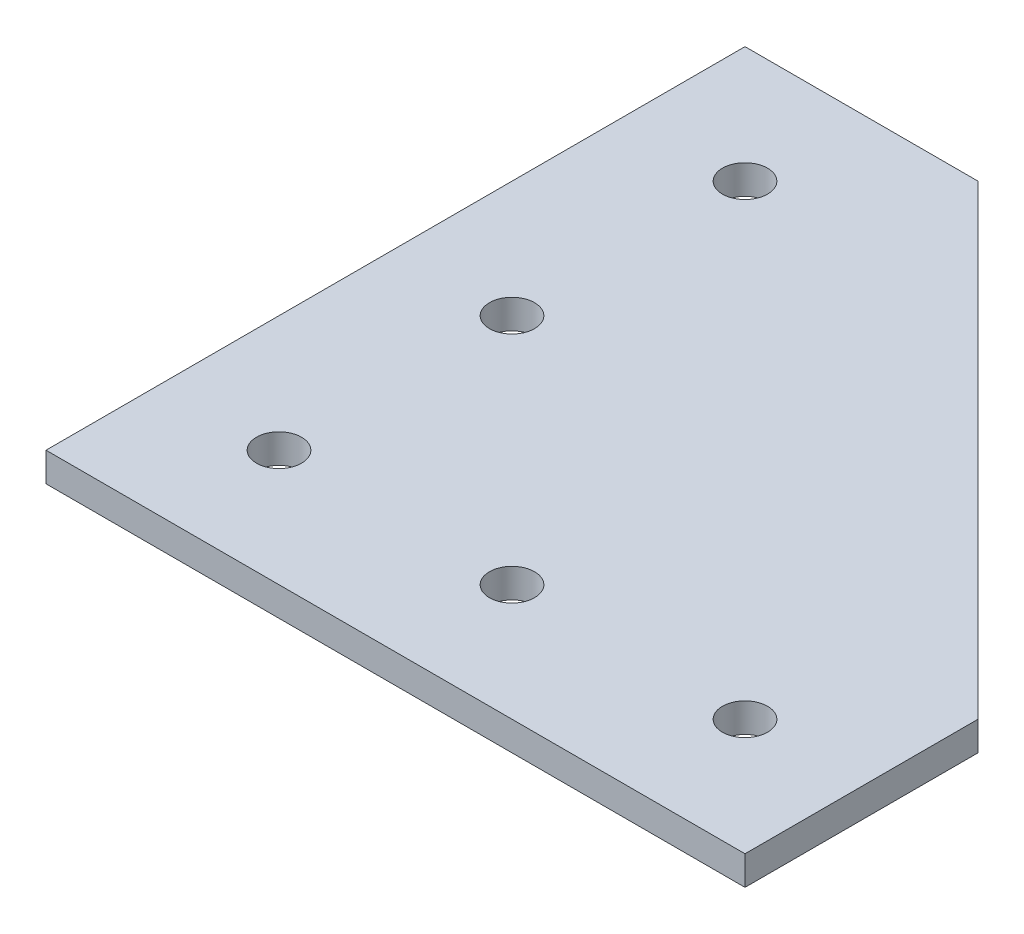
ISO-10303-21;
HEADER;
FILE_DESCRIPTION(('STEP AP214'),'2;1');
FILE_NAME('part.step','',(''),(''),'','','');
FILE_SCHEMA(('AUTOMOTIVE_DESIGN { 1 0 10303 214 1 1 1 1 }'));
ENDSEC;
DATA;
#1=APPLICATION_CONTEXT('core data for automotive mechanical design processes');
#2=APPLICATION_PROTOCOL_DEFINITION('international standard','automotive_design',2000,#1);
#3=PRODUCT_CONTEXT('',#1,'mechanical');
#4=PRODUCT('Part','Part','',(#3));
#5=PRODUCT_RELATED_PRODUCT_CATEGORY('part','',(#4));
#6=PRODUCT_DEFINITION_FORMATION('','',#4);
#7=PRODUCT_DEFINITION_CONTEXT('part definition',#1,'design');
#8=PRODUCT_DEFINITION('design','',#6,#7);
#9=PRODUCT_DEFINITION_SHAPE('','',#8);
#10=(LENGTH_UNIT() NAMED_UNIT(*) SI_UNIT(.MILLI.,.METRE.));
#11=(NAMED_UNIT(*) PLANE_ANGLE_UNIT() SI_UNIT($,.RADIAN.));
#12=(NAMED_UNIT(*) SI_UNIT($,.STERADIAN.) SOLID_ANGLE_UNIT());
#13=UNCERTAINTY_MEASURE_WITH_UNIT(LENGTH_MEASURE(1.E-05),#10,'distance_accuracy_value','');
#14=(GEOMETRIC_REPRESENTATION_CONTEXT(3) GLOBAL_UNCERTAINTY_ASSIGNED_CONTEXT((#13)) GLOBAL_UNIT_ASSIGNED_CONTEXT((#10,
#11,#12)) REPRESENTATION_CONTEXT('',''));
#15=CARTESIAN_POINT('',(0.,0.,0.));
#16=DIRECTION('',(0.,0.,1.));
#17=DIRECTION('',(1.,0.,0.));
#18=AXIS2_PLACEMENT_3D('',#15,#16,#17);
#19=CARTESIAN_POINT('',(76.2,3.175,0.));
#20=DIRECTION('',(0.,0.,-1.));
#21=DIRECTION('',(-1.,0.,0.));
#22=AXIS2_PLACEMENT_3D('',#19,#20,#21);
#23=PLANE('',#22);
#24=DIRECTION('',(1.,0.,0.));
#25=VECTOR('',#24,1.);
#26=CARTESIAN_POINT('',(76.2,0.,0.));
#27=LINE('',#26,#25);
#28=CARTESIAN_POINT('',(0.,0.,0.));
#29=VERTEX_POINT('',#28);
#30=CARTESIAN_POINT('',(76.2,0.,0.));
#31=VERTEX_POINT('',#30);
#32=EDGE_CURVE('E106',#29,#31,#27,.T.);
#33=ORIENTED_EDGE('',*,*,#32,.T.);
#34=DIRECTION('',(0.,-1.,0.));
#35=VECTOR('',#34,1.);
#36=CARTESIAN_POINT('',(76.2,3.175,0.));
#37=LINE('',#36,#35);
#38=CARTESIAN_POINT('',(76.2,3.175,0.));
#39=VERTEX_POINT('',#38);
#40=EDGE_CURVE('E11',#39,#31,#37,.T.);
#41=ORIENTED_EDGE('',*,*,#40,.F.);
#42=DIRECTION('',(1.,0.,0.));
#43=VECTOR('',#42,1.);
#44=CARTESIAN_POINT('',(76.2,3.175,0.));
#45=LINE('',#44,#43);
#46=CARTESIAN_POINT('',(0.,3.175,0.));
#47=VERTEX_POINT('',#46);
#48=EDGE_CURVE('E115',#47,#39,#45,.T.);
#49=ORIENTED_EDGE('',*,*,#48,.F.);
#50=DIRECTION('',(0.,-1.,0.));
#51=VECTOR('',#50,1.);
#52=CARTESIAN_POINT('',(0.,3.175,0.));
#53=LINE('',#52,#51);
#54=EDGE_CURVE('E102',#47,#29,#53,.T.);
#55=ORIENTED_EDGE('',*,*,#54,.T.);
#56=EDGE_LOOP('',(#33,#41,#49,#55));
#57=FACE_BOUND('',#56,.T.);
#58=ADVANCED_FACE('F32',(#57),#23,.F.);
#59=CARTESIAN_POINT('',(76.2,3.175,0.));
#60=DIRECTION('',(-1.,0.,0.));
#61=DIRECTION('',(0.,0.,1.));
#62=AXIS2_PLACEMENT_3D('',#59,#60,#61);
#63=PLANE('',#62);
#64=DIRECTION('',(0.,0.,-1.));
#65=VECTOR('',#64,1.);
#66=CARTESIAN_POINT('',(76.2,0.,0.));
#67=LINE('',#66,#65);
#68=CARTESIAN_POINT('',(76.2,0.,-25.4));
#69=VERTEX_POINT('',#68);
#70=EDGE_CURVE('E109',#31,#69,#67,.T.);
#71=ORIENTED_EDGE('',*,*,#70,.T.);
#72=DIRECTION('',(0.,-1.,0.));
#73=VECTOR('',#72,1.);
#74=CARTESIAN_POINT('',(76.2,3.175,-25.4));
#75=LINE('',#74,#73);
#76=CARTESIAN_POINT('',(76.2,3.175,-25.4));
#77=VERTEX_POINT('',#76);
#78=EDGE_CURVE('E40',#77,#69,#75,.T.);
#79=ORIENTED_EDGE('',*,*,#78,.F.);
#80=DIRECTION('',(0.,0.,-1.));
#81=VECTOR('',#80,1.);
#82=CARTESIAN_POINT('',(76.2,3.175,0.));
#83=LINE('',#82,#81);
#84=EDGE_CURVE('E82',#39,#77,#83,.T.);
#85=ORIENTED_EDGE('',*,*,#84,.F.);
#86=ORIENTED_EDGE('',*,*,#40,.T.);
#87=EDGE_LOOP('',(#71,#79,#85,#86));
#88=FACE_BOUND('',#87,.T.);
#89=ADVANCED_FACE('F135',(#88),#63,.F.);
#90=CARTESIAN_POINT('',(76.2,3.175,-25.4));
#91=DIRECTION('',(-0.707106781186548,0.,0.707106781186548));
#92=DIRECTION('',(0.707106781186548,0.,0.707106781186548));
#93=AXIS2_PLACEMENT_3D('',#90,#91,#92);
#94=PLANE('',#93);
#95=DIRECTION('',(-0.707106781186548,0.,-0.707106781186548));
#96=VECTOR('',#95,1.);
#97=CARTESIAN_POINT('',(76.2,0.,-25.4));
#98=LINE('',#97,#96);
#99=CARTESIAN_POINT('',(25.4,0.,-76.2));
#100=VERTEX_POINT('',#99);
#101=EDGE_CURVE('E97',#69,#100,#98,.T.);
#102=ORIENTED_EDGE('',*,*,#101,.T.);
#103=DIRECTION('',(0.,-1.,0.));
#104=VECTOR('',#103,1.);
#105=CARTESIAN_POINT('',(25.4,3.175,-76.2));
#106=LINE('',#105,#104);
#107=CARTESIAN_POINT('',(25.4,3.175,-76.2));
#108=VERTEX_POINT('',#107);
#109=EDGE_CURVE('E94',#108,#100,#106,.T.);
#110=ORIENTED_EDGE('',*,*,#109,.F.);
#111=DIRECTION('',(-0.707106781186548,0.,-0.707106781186548));
#112=VECTOR('',#111,1.);
#113=CARTESIAN_POINT('',(76.2,3.175,-25.4));
#114=LINE('',#113,#112);
#115=EDGE_CURVE('E86',#77,#108,#114,.T.);
#116=ORIENTED_EDGE('',*,*,#115,.F.);
#117=ORIENTED_EDGE('',*,*,#78,.T.);
#118=EDGE_LOOP('',(#102,#110,#116,#117));
#119=FACE_BOUND('',#118,.T.);
#120=ADVANCED_FACE('F95',(#119),#94,.F.);
#121=CARTESIAN_POINT('',(0.,3.175,-76.2));
#122=DIRECTION('',(0.,0.,1.));
#123=DIRECTION('',(1.,0.,0.));
#124=AXIS2_PLACEMENT_3D('',#121,#122,#123);
#125=PLANE('',#124);
#126=DIRECTION('',(-1.,0.,0.));
#127=VECTOR('',#126,1.);
#128=CARTESIAN_POINT('',(0.,0.,-76.2));
#129=LINE('',#128,#127);
#130=CARTESIAN_POINT('',(0.,0.,-76.2));
#131=VERTEX_POINT('',#130);
#132=EDGE_CURVE('E68',#100,#131,#129,.T.);
#133=ORIENTED_EDGE('',*,*,#132,.T.);
#134=DIRECTION('',(0.,-1.,0.));
#135=VECTOR('',#134,1.);
#136=CARTESIAN_POINT('',(0.,3.175,-76.2));
#137=LINE('',#136,#135);
#138=CARTESIAN_POINT('',(0.,3.175,-76.2));
#139=VERTEX_POINT('',#138);
#140=EDGE_CURVE('E98',#139,#131,#137,.T.);
#141=ORIENTED_EDGE('',*,*,#140,.F.);
#142=DIRECTION('',(-1.,0.,0.));
#143=VECTOR('',#142,1.);
#144=CARTESIAN_POINT('',(0.,3.175,-76.2));
#145=LINE('',#144,#143);
#146=EDGE_CURVE('E90',#108,#139,#145,.T.);
#147=ORIENTED_EDGE('',*,*,#146,.F.);
#148=ORIENTED_EDGE('',*,*,#109,.T.);
#149=EDGE_LOOP('',(#133,#141,#147,#148));
#150=FACE_BOUND('',#149,.T.);
#151=ADVANCED_FACE('F100',(#150),#125,.F.);
#152=CARTESIAN_POINT('',(0.,3.175,0.));
#153=DIRECTION('',(1.,0.,0.));
#154=DIRECTION('',(0.,0.,-1.));
#155=AXIS2_PLACEMENT_3D('',#152,#153,#154);
#156=PLANE('',#155);
#157=DIRECTION('',(0.,0.,1.));
#158=VECTOR('',#157,1.);
#159=CARTESIAN_POINT('',(0.,0.,0.));
#160=LINE('',#159,#158);
#161=EDGE_CURVE('E74',#131,#29,#160,.T.);
#162=ORIENTED_EDGE('',*,*,#161,.T.);
#163=ORIENTED_EDGE('',*,*,#54,.F.);
#164=DIRECTION('',(0.,0.,1.));
#165=VECTOR('',#164,1.);
#166=CARTESIAN_POINT('',(0.,3.175,0.));
#167=LINE('',#166,#165);
#168=EDGE_CURVE('E48',#139,#47,#167,.T.);
#169=ORIENTED_EDGE('',*,*,#168,.F.);
#170=ORIENTED_EDGE('',*,*,#140,.T.);
#171=EDGE_LOOP('',(#162,#163,#169,#170));
#172=FACE_BOUND('',#171,.T.);
#173=ADVANCED_FACE('F123',(#172),#156,.F.);
#174=CARTESIAN_POINT('',(0.,3.175,0.));
#175=DIRECTION('',(0.,-1.,0.));
#176=DIRECTION('',(0.,0.,-1.));
#177=AXIS2_PLACEMENT_3D('',#174,#175,#176);
#178=PLANE('',#177);
#179=CARTESIAN_POINT('',(12.7,3.175,-12.7));
#180=DIRECTION('',(0.,-1.,0.));
#181=DIRECTION('',(0.,0.,-1.));
#182=AXIS2_PLACEMENT_3D('',#179,#180,#181);
#183=CIRCLE('',#182,2.45744999999999);
#184=CARTESIAN_POINT('',(12.7,3.175,-15.15745));
#185=VERTEX_POINT('',#184);
#186=EDGE_CURVE('E227',#185,#185,#183,.T.);
#187=ORIENTED_EDGE('',*,*,#186,.T.);
#188=EDGE_LOOP('',(#187));
#189=FACE_BOUND('',#188,.T.);
#190=CARTESIAN_POINT('',(12.7,3.175,-38.1));
#191=DIRECTION('',(0.,-1.,0.));
#192=DIRECTION('',(0.,0.,-1.));
#193=AXIS2_PLACEMENT_3D('',#190,#191,#192);
#194=CIRCLE('',#193,2.45744999999999);
#195=CARTESIAN_POINT('',(12.7,3.175,-40.55745));
#196=VERTEX_POINT('',#195);
#197=EDGE_CURVE('E231',#196,#196,#194,.T.);
#198=ORIENTED_EDGE('',*,*,#197,.T.);
#199=EDGE_LOOP('',(#198));
#200=FACE_BOUND('',#199,.T.);
#201=CARTESIAN_POINT('',(12.7,3.175,-63.5));
#202=DIRECTION('',(0.,-1.,0.));
#203=DIRECTION('',(0.,0.,-1.));
#204=AXIS2_PLACEMENT_3D('',#201,#202,#203);
#205=CIRCLE('',#204,2.45744999999999);
#206=CARTESIAN_POINT('',(12.7,3.175,-65.95745));
#207=VERTEX_POINT('',#206);
#208=EDGE_CURVE('E240',#207,#207,#205,.T.);
#209=ORIENTED_EDGE('',*,*,#208,.T.);
#210=EDGE_LOOP('',(#209));
#211=FACE_BOUND('',#210,.T.);
#212=CARTESIAN_POINT('',(38.1,3.175,-12.7));
#213=DIRECTION('',(0.,-1.,0.));
#214=DIRECTION('',(0.,0.,-1.));
#215=AXIS2_PLACEMENT_3D('',#212,#213,#214);
#216=CIRCLE('',#215,2.45745);
#217=CARTESIAN_POINT('',(38.1,3.175,-15.15745));
#218=VERTEX_POINT('',#217);
#219=EDGE_CURVE('E246',#218,#218,#216,.T.);
#220=ORIENTED_EDGE('',*,*,#219,.T.);
#221=EDGE_LOOP('',(#220));
#222=FACE_BOUND('',#221,.T.);
#223=CARTESIAN_POINT('',(63.5,3.175,-12.7));
#224=DIRECTION('',(0.,-1.,0.));
#225=DIRECTION('',(0.,0.,-1.));
#226=AXIS2_PLACEMENT_3D('',#223,#224,#225);
#227=CIRCLE('',#226,2.45745);
#228=CARTESIAN_POINT('',(63.5,3.175,-15.15745));
#229=VERTEX_POINT('',#228);
#230=EDGE_CURVE('E110',#229,#229,#227,.T.);
#231=ORIENTED_EDGE('',*,*,#230,.T.);
#232=EDGE_LOOP('',(#231));
#233=FACE_BOUND('',#232,.T.);
#234=ORIENTED_EDGE('',*,*,#48,.T.);
#235=ORIENTED_EDGE('',*,*,#84,.T.);
#236=ORIENTED_EDGE('',*,*,#115,.T.);
#237=ORIENTED_EDGE('',*,*,#146,.T.);
#238=ORIENTED_EDGE('',*,*,#168,.T.);
#239=EDGE_LOOP('',(#234,#235,#236,#237,#238));
#240=FACE_BOUND('',#239,.T.);
#241=ADVANCED_FACE('F88',(#189,#200,#211,#222,#233,#240),#178,.F.);
#242=CARTESIAN_POINT('',(0.,0.,0.));
#243=DIRECTION('',(0.,-1.,0.));
#244=DIRECTION('',(0.,0.,-1.));
#245=AXIS2_PLACEMENT_3D('',#242,#243,#244);
#246=PLANE('',#245);
#247=CARTESIAN_POINT('',(12.7,0.,-12.7));
#248=DIRECTION('',(0.,-1.,0.));
#249=DIRECTION('',(0.,0.,-1.));
#250=AXIS2_PLACEMENT_3D('',#247,#248,#249);
#251=CIRCLE('',#250,2.45745);
#252=CARTESIAN_POINT('',(12.7,0.,-15.15745));
#253=VERTEX_POINT('',#252);
#254=EDGE_CURVE('E224',#253,#253,#251,.T.);
#255=ORIENTED_EDGE('',*,*,#254,.F.);
#256=EDGE_LOOP('',(#255));
#257=FACE_BOUND('',#256,.T.);
#258=CARTESIAN_POINT('',(12.7,0.,-38.1));
#259=DIRECTION('',(0.,-1.,0.));
#260=DIRECTION('',(0.,0.,-1.));
#261=AXIS2_PLACEMENT_3D('',#258,#259,#260);
#262=CIRCLE('',#261,2.45745);
#263=CARTESIAN_POINT('',(12.7,0.,-40.55745));
#264=VERTEX_POINT('',#263);
#265=EDGE_CURVE('E228',#264,#264,#262,.T.);
#266=ORIENTED_EDGE('',*,*,#265,.F.);
#267=EDGE_LOOP('',(#266));
#268=FACE_BOUND('',#267,.T.);
#269=CARTESIAN_POINT('',(12.7,0.,-63.5));
#270=DIRECTION('',(0.,-1.,0.));
#271=DIRECTION('',(0.,0.,-1.));
#272=AXIS2_PLACEMENT_3D('',#269,#270,#271);
#273=CIRCLE('',#272,2.45745);
#274=CARTESIAN_POINT('',(12.7,0.,-65.95745));
#275=VERTEX_POINT('',#274);
#276=EDGE_CURVE('E237',#275,#275,#273,.T.);
#277=ORIENTED_EDGE('',*,*,#276,.F.);
#278=EDGE_LOOP('',(#277));
#279=FACE_BOUND('',#278,.T.);
#280=CARTESIAN_POINT('',(38.1,0.,-12.7));
#281=DIRECTION('',(0.,-1.,0.));
#282=DIRECTION('',(0.,0.,-1.));
#283=AXIS2_PLACEMENT_3D('',#280,#281,#282);
#284=CIRCLE('',#283,2.45745);
#285=CARTESIAN_POINT('',(38.1,0.,-15.15745));
#286=VERTEX_POINT('',#285);
#287=EDGE_CURVE('E243',#286,#286,#284,.T.);
#288=ORIENTED_EDGE('',*,*,#287,.F.);
#289=EDGE_LOOP('',(#288));
#290=FACE_BOUND('',#289,.T.);
#291=CARTESIAN_POINT('',(63.5,0.,-12.7));
#292=DIRECTION('',(0.,-1.,0.));
#293=DIRECTION('',(0.,0.,-1.));
#294=AXIS2_PLACEMENT_3D('',#291,#292,#293);
#295=CIRCLE('',#294,2.45745);
#296=CARTESIAN_POINT('',(63.5,0.,-15.15745));
#297=VERTEX_POINT('',#296);
#298=EDGE_CURVE('E249',#297,#297,#295,.T.);
#299=ORIENTED_EDGE('',*,*,#298,.F.);
#300=EDGE_LOOP('',(#299));
#301=FACE_BOUND('',#300,.T.);
#302=ORIENTED_EDGE('',*,*,#32,.F.);
#303=ORIENTED_EDGE('',*,*,#161,.F.);
#304=ORIENTED_EDGE('',*,*,#132,.F.);
#305=ORIENTED_EDGE('',*,*,#101,.F.);
#306=ORIENTED_EDGE('',*,*,#70,.F.);
#307=EDGE_LOOP('',(#302,#303,#304,#305,#306));
#308=FACE_BOUND('',#307,.T.);
#309=ADVANCED_FACE('F119',(#257,#268,#279,#290,#301,#308),#246,.T.);
#310=CARTESIAN_POINT('',(63.5,0.,-12.7));
#311=DIRECTION('',(0.,-1.,0.));
#312=DIRECTION('',(0.,0.,-1.));
#313=AXIS2_PLACEMENT_3D('',#310,#311,#312);
#314=CYLINDRICAL_SURFACE('',#313,2.45745);
#315=ORIENTED_EDGE('',*,*,#298,.T.);
#316=EDGE_LOOP('',(#315));
#317=FACE_BOUND('',#316,.T.);
#318=ORIENTED_EDGE('',*,*,#230,.F.);
#319=EDGE_LOOP('',(#318));
#320=FACE_BOUND('',#319,.T.);
#321=ADVANCED_FACE('F168',(#317,#320),#314,.F.);
#322=CARTESIAN_POINT('',(38.1,0.,-12.7));
#323=DIRECTION('',(0.,-1.,0.));
#324=DIRECTION('',(0.,0.,-1.));
#325=AXIS2_PLACEMENT_3D('',#322,#323,#324);
#326=CYLINDRICAL_SURFACE('',#325,2.45745);
#327=ORIENTED_EDGE('',*,*,#287,.T.);
#328=EDGE_LOOP('',(#327));
#329=FACE_BOUND('',#328,.T.);
#330=ORIENTED_EDGE('',*,*,#219,.F.);
#331=EDGE_LOOP('',(#330));
#332=FACE_BOUND('',#331,.T.);
#333=ADVANCED_FACE('F177',(#329,#332),#326,.F.);
#334=CARTESIAN_POINT('',(12.7,0.,-63.5));
#335=DIRECTION('',(0.,-1.,0.));
#336=DIRECTION('',(0.,0.,-1.));
#337=AXIS2_PLACEMENT_3D('',#334,#335,#336);
#338=CYLINDRICAL_SURFACE('',#337,2.45744999999999);
#339=ORIENTED_EDGE('',*,*,#276,.T.);
#340=EDGE_LOOP('',(#339));
#341=FACE_BOUND('',#340,.T.);
#342=ORIENTED_EDGE('',*,*,#208,.F.);
#343=EDGE_LOOP('',(#342));
#344=FACE_BOUND('',#343,.T.);
#345=ADVANCED_FACE('F187',(#341,#344),#338,.F.);
#346=CARTESIAN_POINT('',(12.7,0.,-38.1));
#347=DIRECTION('',(0.,-1.,0.));
#348=DIRECTION('',(0.,0.,-1.));
#349=AXIS2_PLACEMENT_3D('',#346,#347,#348);
#350=CYLINDRICAL_SURFACE('',#349,2.45744999999999);
#351=ORIENTED_EDGE('',*,*,#265,.T.);
#352=EDGE_LOOP('',(#351));
#353=FACE_BOUND('',#352,.T.);
#354=ORIENTED_EDGE('',*,*,#197,.F.);
#355=EDGE_LOOP('',(#354));
#356=FACE_BOUND('',#355,.T.);
#357=ADVANCED_FACE('F197',(#353,#356),#350,.F.);
#358=CARTESIAN_POINT('',(12.7,0.,-12.7));
#359=DIRECTION('',(0.,-1.,0.));
#360=DIRECTION('',(0.,0.,-1.));
#361=AXIS2_PLACEMENT_3D('',#358,#359,#360);
#362=CYLINDRICAL_SURFACE('',#361,2.45744999999999);
#363=ORIENTED_EDGE('',*,*,#254,.T.);
#364=EDGE_LOOP('',(#363));
#365=FACE_BOUND('',#364,.T.);
#366=ORIENTED_EDGE('',*,*,#186,.F.);
#367=EDGE_LOOP('',(#366));
#368=FACE_BOUND('',#367,.T.);
#369=ADVANCED_FACE('F207',(#365,#368),#362,.F.);
#370=CLOSED_SHELL('',(#58,#89,#120,#151,#173,#241,#309,#321,#333,#345,#357,#369));
#371=MANIFOLD_SOLID_BREP('B2',#370);
#372=ADVANCED_BREP_SHAPE_REPRESENTATION('',(#18,#371),#14);
#373=SHAPE_DEFINITION_REPRESENTATION(#9,#372);
ENDSEC;
END-ISO-10303-21;
